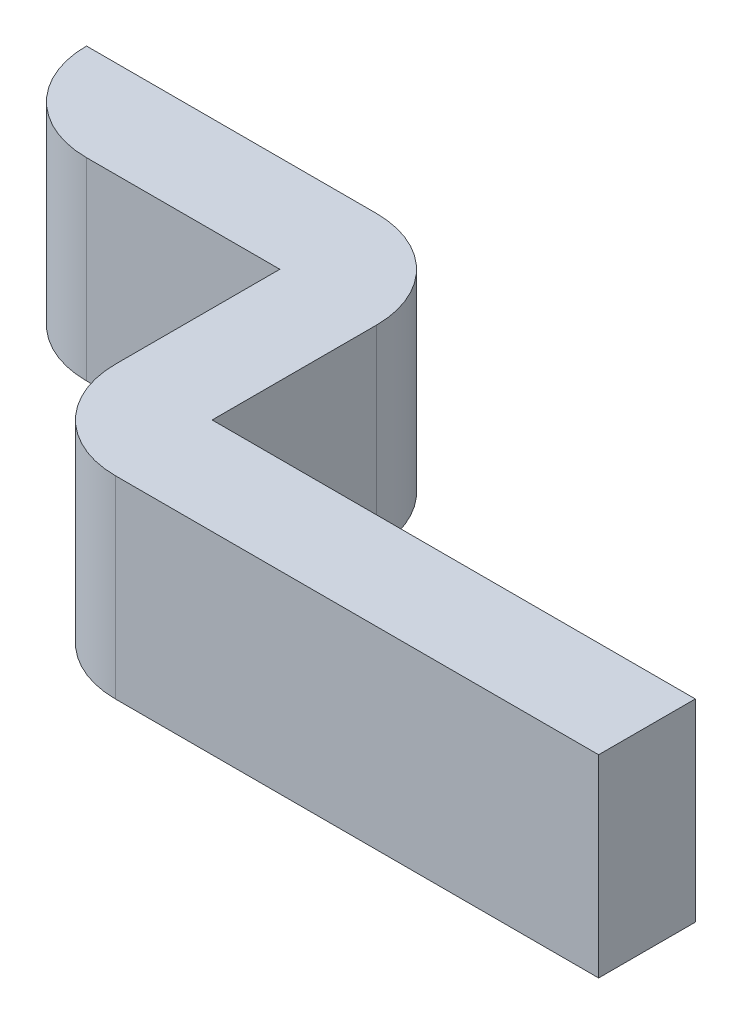
ISO-10303-21;
HEADER;
FILE_DESCRIPTION(('STEP AP214'),'2;1');
FILE_NAME('part.step','',(''),(''),'','','');
FILE_SCHEMA(('AUTOMOTIVE_DESIGN { 1 0 10303 214 1 1 1 1 }'));
ENDSEC;
DATA;
#1=APPLICATION_CONTEXT('core data for automotive mechanical design processes');
#2=APPLICATION_PROTOCOL_DEFINITION('international standard','automotive_design',2000,#1);
#3=PRODUCT_CONTEXT('',#1,'mechanical');
#4=PRODUCT('Part','Part','',(#3));
#5=PRODUCT_RELATED_PRODUCT_CATEGORY('part','',(#4));
#6=PRODUCT_DEFINITION_FORMATION('','',#4);
#7=PRODUCT_DEFINITION_CONTEXT('part definition',#1,'design');
#8=PRODUCT_DEFINITION('design','',#6,#7);
#9=PRODUCT_DEFINITION_SHAPE('','',#8);
#10=(LENGTH_UNIT() NAMED_UNIT(*) SI_UNIT(.MILLI.,.METRE.));
#11=(NAMED_UNIT(*) PLANE_ANGLE_UNIT() SI_UNIT($,.RADIAN.));
#12=(NAMED_UNIT(*) SI_UNIT($,.STERADIAN.) SOLID_ANGLE_UNIT());
#13=UNCERTAINTY_MEASURE_WITH_UNIT(LENGTH_MEASURE(1.E-05),#10,'distance_accuracy_value','');
#14=(GEOMETRIC_REPRESENTATION_CONTEXT(3) GLOBAL_UNCERTAINTY_ASSIGNED_CONTEXT((#13)) GLOBAL_UNIT_ASSIGNED_CONTEXT((#10,
#11,#12)) REPRESENTATION_CONTEXT('',''));
#15=CARTESIAN_POINT('',(0.,0.,0.));
#16=DIRECTION('',(0.,0.,1.));
#17=DIRECTION('',(1.,0.,0.));
#18=AXIS2_PLACEMENT_3D('',#15,#16,#17);
#19=CARTESIAN_POINT('',(-1.0033,1.2954,0.));
#20=DIRECTION('',(0.,-1.,0.));
#21=DIRECTION('',(0.,0.,-1.));
#22=AXIS2_PLACEMENT_3D('',#19,#20,#21);
#23=PLANE('',#22);
#24=DIRECTION('',(-1.,0.,0.));
#25=VECTOR('',#24,1.);
#26=CARTESIAN_POINT('',(-0.8763,1.2954,0.127));
#27=LINE('',#26,#25);
#28=CARTESIAN_POINT('',(-0.8763,1.2954,0.127));
#29=VERTEX_POINT('',#28);
#30=CARTESIAN_POINT('',(-0.6223,1.2954,0.127));
#31=VERTEX_POINT('',#30);
#32=EDGE_CURVE('E101',#29,#31,#27,.F.);
#33=ORIENTED_EDGE('',*,*,#32,.T.);
#34=DIRECTION('',(0.,0.,-1.));
#35=VECTOR('',#34,1.);
#36=CARTESIAN_POINT('',(-0.6223,1.2954,0.127));
#37=LINE('',#36,#35);
#38=CARTESIAN_POINT('',(-0.6223,1.2954,0.3429));
#39=VERTEX_POINT('',#38);
#40=EDGE_CURVE('E104',#31,#39,#37,.F.);
#41=ORIENTED_EDGE('',*,*,#40,.T.);
#42=CARTESIAN_POINT('',(-0.4953,1.2954,0.3429));
#43=DIRECTION('',(0.,-1.,0.));
#44=DIRECTION('',(0.,0.,-1.));
#45=AXIS2_PLACEMENT_3D('',#42,#43,#44);
#46=CIRCLE('',#45,0.127);
#47=CARTESIAN_POINT('',(-0.4953,1.2954,0.4699));
#48=VERTEX_POINT('',#47);
#49=EDGE_CURVE('E116',#48,#39,#46,.T.);
#50=ORIENTED_EDGE('',*,*,#49,.F.);
#51=DIRECTION('',(-1.,0.,0.));
#52=VECTOR('',#51,1.);
#53=CARTESIAN_POINT('',(-0.4953,1.2954,0.4699));
#54=LINE('',#53,#52);
#55=CARTESIAN_POINT('',(0.13942,1.2954,0.4699));
#56=VERTEX_POINT('',#55);
#57=EDGE_CURVE('E133',#48,#56,#54,.F.);
#58=ORIENTED_EDGE('',*,*,#57,.T.);
#59=DIRECTION('',(0.,0.,1.));
#60=VECTOR('',#59,1.);
#61=CARTESIAN_POINT('',(0.13942,1.2954,0.4699));
#62=LINE('',#61,#60);
#63=CARTESIAN_POINT('',(0.13942,1.2954,0.3429));
#64=VERTEX_POINT('',#63);
#65=EDGE_CURVE('E89',#56,#64,#62,.F.);
#66=ORIENTED_EDGE('',*,*,#65,.T.);
#67=DIRECTION('',(1.,0.,0.));
#68=VECTOR('',#67,1.);
#69=CARTESIAN_POINT('',(0.13942,1.2954,0.3429));
#70=LINE('',#69,#68);
#71=CARTESIAN_POINT('',(-0.4953,1.2954,0.3429));
#72=VERTEX_POINT('',#71);
#73=EDGE_CURVE('E86',#64,#72,#70,.F.);
#74=ORIENTED_EDGE('',*,*,#73,.T.);
#75=DIRECTION('',(0.,0.,1.));
#76=VECTOR('',#75,1.);
#77=CARTESIAN_POINT('',(-0.4953,1.2954,0.3429));
#78=LINE('',#77,#76);
#79=CARTESIAN_POINT('',(-0.4953,1.2954,0.127));
#80=VERTEX_POINT('',#79);
#81=EDGE_CURVE('E81',#72,#80,#78,.F.);
#82=ORIENTED_EDGE('',*,*,#81,.T.);
#83=CARTESIAN_POINT('',(-0.6223,1.2954,0.127));
#84=DIRECTION('',(0.,-1.,0.));
#85=DIRECTION('',(0.,0.,-1.));
#86=AXIS2_PLACEMENT_3D('',#83,#84,#85);
#87=CIRCLE('',#86,0.127);
#88=CARTESIAN_POINT('',(-0.6223,1.2954,0.));
#89=VERTEX_POINT('',#88);
#90=EDGE_CURVE('E19',#89,#80,#87,.T.);
#91=ORIENTED_EDGE('',*,*,#90,.F.);
#92=DIRECTION('',(1.,0.,0.));
#93=VECTOR('',#92,1.);
#94=CARTESIAN_POINT('',(-0.6223,1.2954,0.));
#95=LINE('',#94,#93);
#96=CARTESIAN_POINT('',(-1.0033,1.2954,0.));
#97=VERTEX_POINT('',#96);
#98=EDGE_CURVE('E75',#89,#97,#95,.F.);
#99=ORIENTED_EDGE('',*,*,#98,.T.);
#100=CARTESIAN_POINT('',(-0.8763,1.2954,0.));
#101=DIRECTION('',(0.,-1.,0.));
#102=DIRECTION('',(0.,0.,-1.));
#103=AXIS2_PLACEMENT_3D('',#100,#101,#102);
#104=CIRCLE('',#103,0.127);
#105=EDGE_CURVE('E107',#29,#97,#104,.T.);
#106=ORIENTED_EDGE('',*,*,#105,.F.);
#107=EDGE_LOOP('',(#33,#41,#50,#58,#66,#74,#82,#91,#99,#106));
#108=FACE_BOUND('',#107,.T.);
#109=ADVANCED_FACE('F16',(#108),#23,.F.);
#110=CARTESIAN_POINT('',(-0.6223,1.0414,0.));
#111=DIRECTION('',(0.,0.,1.));
#112=DIRECTION('',(1.,0.,0.));
#113=AXIS2_PLACEMENT_3D('',#110,#111,#112);
#114=PLANE('',#113);
#115=DIRECTION('',(0.,-1.,0.));
#116=VECTOR('',#115,1.);
#117=CARTESIAN_POINT('',(-1.0033,1.0414,0.));
#118=LINE('',#117,#116);
#119=CARTESIAN_POINT('',(-1.0033,1.0414,0.));
#120=VERTEX_POINT('',#119);
#121=EDGE_CURVE('E186',#97,#120,#118,.T.);
#122=ORIENTED_EDGE('',*,*,#121,.F.);
#123=ORIENTED_EDGE('',*,*,#98,.F.);
#124=DIRECTION('',(0.,-1.,0.));
#125=VECTOR('',#124,1.);
#126=CARTESIAN_POINT('',(-0.6223,1.0414,0.));
#127=LINE('',#126,#125);
#128=CARTESIAN_POINT('',(-0.6223,1.0414,0.));
#129=VERTEX_POINT('',#128);
#130=EDGE_CURVE('E158',#129,#89,#127,.F.);
#131=ORIENTED_EDGE('',*,*,#130,.F.);
#132=DIRECTION('',(1.,0.,0.));
#133=VECTOR('',#132,1.);
#134=CARTESIAN_POINT('',(-1.0033,1.0414,0.));
#135=LINE('',#134,#133);
#136=EDGE_CURVE('E185',#120,#129,#135,.T.);
#137=ORIENTED_EDGE('',*,*,#136,.F.);
#138=EDGE_LOOP('',(#122,#123,#131,#137));
#139=FACE_BOUND('',#138,.T.);
#140=ADVANCED_FACE('F216',(#139),#114,.F.);
#141=CARTESIAN_POINT('',(-0.6223,1.0414,0.127));
#142=DIRECTION('',(0.,-1.,0.));
#143=DIRECTION('',(0.,0.,-1.));
#144=AXIS2_PLACEMENT_3D('',#141,#142,#143);
#145=CYLINDRICAL_SURFACE('',#144,0.127);
#146=ORIENTED_EDGE('',*,*,#90,.T.);
#147=DIRECTION('',(0.,1.,0.));
#148=VECTOR('',#147,1.);
#149=CARTESIAN_POINT('',(-0.4953,1.0414,0.127));
#150=LINE('',#149,#148);
#151=CARTESIAN_POINT('',(-0.4953,1.0414,0.127));
#152=VERTEX_POINT('',#151);
#153=EDGE_CURVE('E156',#80,#152,#150,.F.);
#154=ORIENTED_EDGE('',*,*,#153,.T.);
#155=CARTESIAN_POINT('',(-0.6223,1.0414,0.127));
#156=DIRECTION('',(0.,-1.,0.));
#157=DIRECTION('',(0.,0.,-1.));
#158=AXIS2_PLACEMENT_3D('',#155,#156,#157);
#159=CIRCLE('',#158,0.127);
#160=EDGE_CURVE('E182',#129,#152,#159,.T.);
#161=ORIENTED_EDGE('',*,*,#160,.F.);
#162=ORIENTED_EDGE('',*,*,#130,.T.);
#163=EDGE_LOOP('',(#146,#154,#161,#162));
#164=FACE_BOUND('',#163,.T.);
#165=ADVANCED_FACE('F213',(#164),#145,.T.);
#166=CARTESIAN_POINT('',(-0.4953,1.0414,0.3429));
#167=DIRECTION('',(-1.,0.,0.));
#168=DIRECTION('',(0.,0.,1.));
#169=AXIS2_PLACEMENT_3D('',#166,#167,#168);
#170=PLANE('',#169);
#171=ORIENTED_EDGE('',*,*,#153,.F.);
#172=ORIENTED_EDGE('',*,*,#81,.F.);
#173=DIRECTION('',(0.,1.,0.));
#174=VECTOR('',#173,1.);
#175=CARTESIAN_POINT('',(-0.4953,1.0414,0.3429));
#176=LINE('',#175,#174);
#177=CARTESIAN_POINT('',(-0.4953,1.0414,0.3429));
#178=VERTEX_POINT('',#177);
#179=EDGE_CURVE('E152',#72,#178,#176,.F.);
#180=ORIENTED_EDGE('',*,*,#179,.T.);
#181=DIRECTION('',(0.,0.,-1.));
#182=VECTOR('',#181,1.);
#183=CARTESIAN_POINT('',(-0.4953,1.0414,0.));
#184=LINE('',#183,#182);
#185=EDGE_CURVE('E149',#152,#178,#184,.F.);
#186=ORIENTED_EDGE('',*,*,#185,.F.);
#187=EDGE_LOOP('',(#171,#172,#180,#186));
#188=FACE_BOUND('',#187,.T.);
#189=ADVANCED_FACE('F210',(#188),#170,.F.);
#190=CARTESIAN_POINT('',(0.13942,1.0414,0.3429));
#191=DIRECTION('',(0.,0.,1.));
#192=DIRECTION('',(1.,0.,0.));
#193=AXIS2_PLACEMENT_3D('',#190,#191,#192);
#194=PLANE('',#193);
#195=ORIENTED_EDGE('',*,*,#179,.F.);
#196=ORIENTED_EDGE('',*,*,#73,.F.);
#197=DIRECTION('',(0.,1.,0.));
#198=VECTOR('',#197,1.);
#199=CARTESIAN_POINT('',(0.13942,1.0414,0.3429));
#200=LINE('',#199,#198);
#201=CARTESIAN_POINT('',(0.13942,1.0414,0.3429));
#202=VERTEX_POINT('',#201);
#203=EDGE_CURVE('E143',#64,#202,#200,.F.);
#204=ORIENTED_EDGE('',*,*,#203,.T.);
#205=DIRECTION('',(1.,0.,0.));
#206=VECTOR('',#205,1.);
#207=CARTESIAN_POINT('',(-1.0033,1.0414,0.3429));
#208=LINE('',#207,#206);
#209=EDGE_CURVE('E140',#178,#202,#208,.T.);
#210=ORIENTED_EDGE('',*,*,#209,.F.);
#211=EDGE_LOOP('',(#195,#196,#204,#210));
#212=FACE_BOUND('',#211,.T.);
#213=ADVANCED_FACE('F207',(#212),#194,.F.);
#214=CARTESIAN_POINT('',(0.13942,1.0414,0.4699));
#215=DIRECTION('',(-1.,0.,0.));
#216=DIRECTION('',(0.,0.,1.));
#217=AXIS2_PLACEMENT_3D('',#214,#215,#216);
#218=PLANE('',#217);
#219=ORIENTED_EDGE('',*,*,#203,.F.);
#220=ORIENTED_EDGE('',*,*,#65,.F.);
#221=DIRECTION('',(0.,1.,0.));
#222=VECTOR('',#221,1.);
#223=CARTESIAN_POINT('',(0.13942,1.0414,0.4699));
#224=LINE('',#223,#222);
#225=CARTESIAN_POINT('',(0.13942,1.0414,0.4699));
#226=VERTEX_POINT('',#225);
#227=EDGE_CURVE('E131',#56,#226,#224,.F.);
#228=ORIENTED_EDGE('',*,*,#227,.T.);
#229=DIRECTION('',(0.,0.,-1.));
#230=VECTOR('',#229,1.);
#231=CARTESIAN_POINT('',(0.13942,1.0414,0.));
#232=LINE('',#231,#230);
#233=EDGE_CURVE('E136',#202,#226,#232,.F.);
#234=ORIENTED_EDGE('',*,*,#233,.F.);
#235=EDGE_LOOP('',(#219,#220,#228,#234));
#236=FACE_BOUND('',#235,.T.);
#237=ADVANCED_FACE('F194',(#236),#218,.F.);
#238=CARTESIAN_POINT('',(-0.4953,1.0414,0.4699));
#239=DIRECTION('',(0.,0.,-1.));
#240=DIRECTION('',(-1.,0.,0.));
#241=AXIS2_PLACEMENT_3D('',#238,#239,#240);
#242=PLANE('',#241);
#243=ORIENTED_EDGE('',*,*,#227,.F.);
#244=ORIENTED_EDGE('',*,*,#57,.F.);
#245=DIRECTION('',(0.,-1.,0.));
#246=VECTOR('',#245,1.);
#247=CARTESIAN_POINT('',(-0.4953,1.0414,0.4699));
#248=LINE('',#247,#246);
#249=CARTESIAN_POINT('',(-0.4953,1.0414,0.4699));
#250=VERTEX_POINT('',#249);
#251=EDGE_CURVE('E128',#250,#48,#248,.F.);
#252=ORIENTED_EDGE('',*,*,#251,.F.);
#253=DIRECTION('',(1.,0.,0.));
#254=VECTOR('',#253,1.);
#255=CARTESIAN_POINT('',(-1.0033,1.0414,0.4699));
#256=LINE('',#255,#254);
#257=EDGE_CURVE('E139',#226,#250,#256,.F.);
#258=ORIENTED_EDGE('',*,*,#257,.F.);
#259=EDGE_LOOP('',(#243,#244,#252,#258));
#260=FACE_BOUND('',#259,.T.);
#261=ADVANCED_FACE('F197',(#260),#242,.F.);
#262=CARTESIAN_POINT('',(-0.4953,1.0414,0.3429));
#263=DIRECTION('',(0.,-1.,0.));
#264=DIRECTION('',(0.,0.,-1.));
#265=AXIS2_PLACEMENT_3D('',#262,#263,#264);
#266=CYLINDRICAL_SURFACE('',#265,0.127);
#267=ORIENTED_EDGE('',*,*,#49,.T.);
#268=DIRECTION('',(0.,1.,0.));
#269=VECTOR('',#268,1.);
#270=CARTESIAN_POINT('',(-0.6223,1.0414,0.3429));
#271=LINE('',#270,#269);
#272=CARTESIAN_POINT('',(-0.6223,1.0414,0.3429));
#273=VERTEX_POINT('',#272);
#274=EDGE_CURVE('E110',#39,#273,#271,.F.);
#275=ORIENTED_EDGE('',*,*,#274,.T.);
#276=CARTESIAN_POINT('',(-0.4953,1.0414,0.3429));
#277=DIRECTION('',(0.,-1.,0.));
#278=DIRECTION('',(0.,0.,-1.));
#279=AXIS2_PLACEMENT_3D('',#276,#277,#278);
#280=CIRCLE('',#279,0.127);
#281=EDGE_CURVE('E178',#250,#273,#280,.T.);
#282=ORIENTED_EDGE('',*,*,#281,.F.);
#283=ORIENTED_EDGE('',*,*,#251,.T.);
#284=EDGE_LOOP('',(#267,#275,#282,#283));
#285=FACE_BOUND('',#284,.T.);
#286=ADVANCED_FACE('F188',(#285),#266,.T.);
#287=CARTESIAN_POINT('',(-0.6223,1.0414,0.127));
#288=DIRECTION('',(1.,0.,0.));
#289=DIRECTION('',(0.,0.,-1.));
#290=AXIS2_PLACEMENT_3D('',#287,#288,#289);
#291=PLANE('',#290);
#292=ORIENTED_EDGE('',*,*,#274,.F.);
#293=ORIENTED_EDGE('',*,*,#40,.F.);
#294=DIRECTION('',(0.,1.,0.));
#295=VECTOR('',#294,1.);
#296=CARTESIAN_POINT('',(-0.6223,1.0414,0.127));
#297=LINE('',#296,#295);
#298=CARTESIAN_POINT('',(-0.6223,1.0414,0.127));
#299=VERTEX_POINT('',#298);
#300=EDGE_CURVE('E109',#31,#299,#297,.F.);
#301=ORIENTED_EDGE('',*,*,#300,.T.);
#302=DIRECTION('',(0.,0.,-1.));
#303=VECTOR('',#302,1.);
#304=CARTESIAN_POINT('',(-0.6223,1.0414,0.));
#305=LINE('',#304,#303);
#306=EDGE_CURVE('E181',#273,#299,#305,.T.);
#307=ORIENTED_EDGE('',*,*,#306,.F.);
#308=EDGE_LOOP('',(#292,#293,#301,#307));
#309=FACE_BOUND('',#308,.T.);
#310=ADVANCED_FACE('F114',(#309),#291,.F.);
#311=CARTESIAN_POINT('',(-0.8763,1.0414,0.127));
#312=DIRECTION('',(0.,0.,-1.));
#313=DIRECTION('',(-1.,0.,0.));
#314=AXIS2_PLACEMENT_3D('',#311,#312,#313);
#315=PLANE('',#314);
#316=ORIENTED_EDGE('',*,*,#300,.F.);
#317=ORIENTED_EDGE('',*,*,#32,.F.);
#318=DIRECTION('',(0.,-1.,0.));
#319=VECTOR('',#318,1.);
#320=CARTESIAN_POINT('',(-0.8763,1.0414,0.127));
#321=LINE('',#320,#319);
#322=CARTESIAN_POINT('',(-0.8763,1.0414,0.127));
#323=VERTEX_POINT('',#322);
#324=EDGE_CURVE('E34',#323,#29,#321,.F.);
#325=ORIENTED_EDGE('',*,*,#324,.F.);
#326=DIRECTION('',(1.,0.,0.));
#327=VECTOR('',#326,1.);
#328=CARTESIAN_POINT('',(-1.0033,1.0414,0.127));
#329=LINE('',#328,#327);
#330=EDGE_CURVE('E25',#299,#323,#329,.F.);
#331=ORIENTED_EDGE('',*,*,#330,.F.);
#332=EDGE_LOOP('',(#316,#317,#325,#331));
#333=FACE_BOUND('',#332,.T.);
#334=ADVANCED_FACE('F118',(#333),#315,.F.);
#335=CARTESIAN_POINT('',(-0.8763,1.0414,0.));
#336=DIRECTION('',(0.,-1.,0.));
#337=DIRECTION('',(0.,0.,-1.));
#338=AXIS2_PLACEMENT_3D('',#335,#336,#337);
#339=CYLINDRICAL_SURFACE('',#338,0.127);
#340=ORIENTED_EDGE('',*,*,#105,.T.);
#341=ORIENTED_EDGE('',*,*,#121,.T.);
#342=CARTESIAN_POINT('',(-0.8763,1.0414,0.));
#343=DIRECTION('',(0.,-1.,0.));
#344=DIRECTION('',(0.,0.,-1.));
#345=AXIS2_PLACEMENT_3D('',#342,#343,#344);
#346=CIRCLE('',#345,0.127);
#347=EDGE_CURVE('E11',#323,#120,#346,.T.);
#348=ORIENTED_EDGE('',*,*,#347,.F.);
#349=ORIENTED_EDGE('',*,*,#324,.T.);
#350=EDGE_LOOP('',(#340,#341,#348,#349));
#351=FACE_BOUND('',#350,.T.);
#352=ADVANCED_FACE('F218',(#351),#339,.T.);
#353=CARTESIAN_POINT('',(-1.0033,1.0414,0.));
#354=DIRECTION('',(0.,-1.,0.));
#355=DIRECTION('',(0.,0.,-1.));
#356=AXIS2_PLACEMENT_3D('',#353,#354,#355);
#357=PLANE('',#356);
#358=ORIENTED_EDGE('',*,*,#330,.T.);
#359=ORIENTED_EDGE('',*,*,#347,.T.);
#360=ORIENTED_EDGE('',*,*,#136,.T.);
#361=ORIENTED_EDGE('',*,*,#160,.T.);
#362=ORIENTED_EDGE('',*,*,#185,.T.);
#363=ORIENTED_EDGE('',*,*,#209,.T.);
#364=ORIENTED_EDGE('',*,*,#233,.T.);
#365=ORIENTED_EDGE('',*,*,#257,.T.);
#366=ORIENTED_EDGE('',*,*,#281,.T.);
#367=ORIENTED_EDGE('',*,*,#306,.T.);
#368=EDGE_LOOP('',(#358,#359,#360,#361,#362,#363,#364,#365,#366,#367));
#369=FACE_BOUND('',#368,.T.);
#370=ADVANCED_FACE('F201',(#369),#357,.T.);
#371=CLOSED_SHELL('',(#109,#140,#165,#189,#213,#237,#261,#286,#310,#334,#352,#370));
#372=MANIFOLD_SOLID_BREP('B1',#371);
#373=ADVANCED_BREP_SHAPE_REPRESENTATION('',(#18,#372),#14);
#374=SHAPE_DEFINITION_REPRESENTATION(#9,#373);
ENDSEC;
END-ISO-10303-21;
